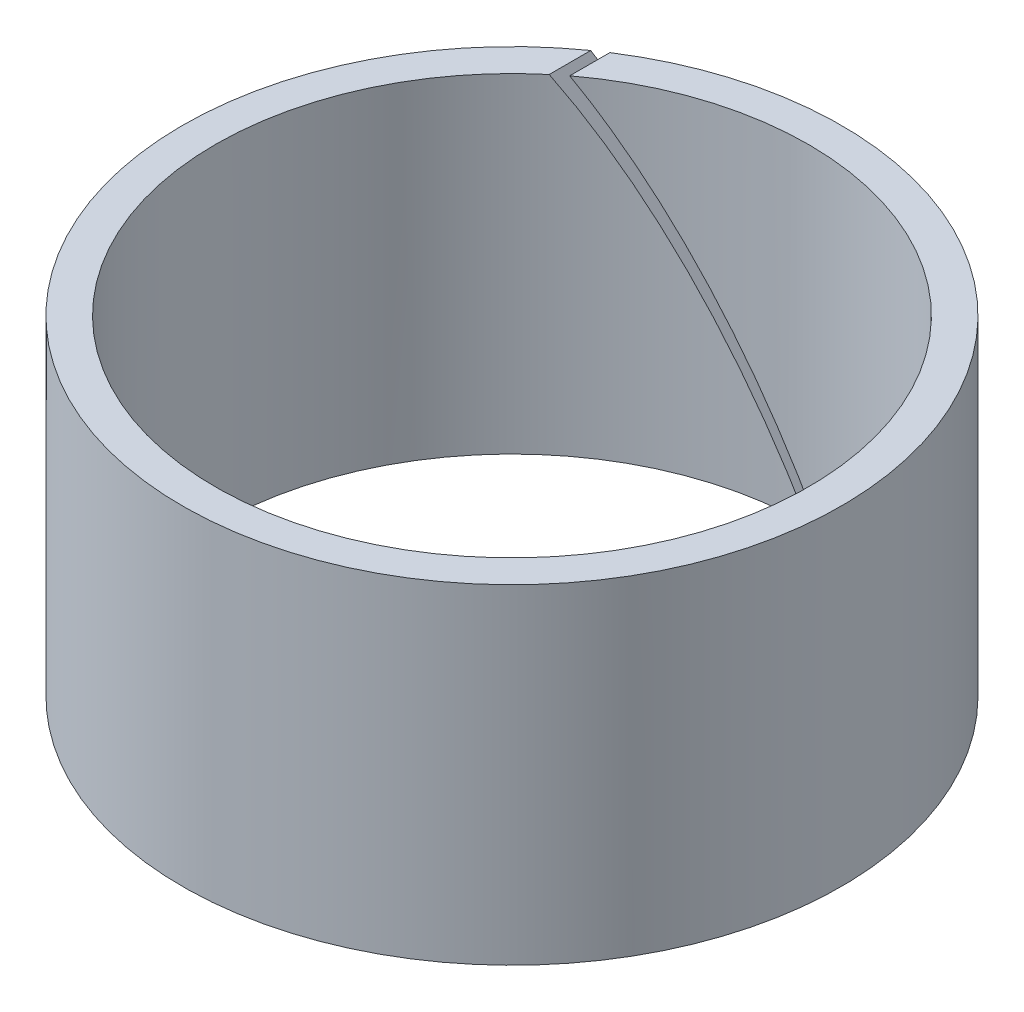
ISO-10303-21;
HEADER;
FILE_DESCRIPTION(('STEP AP214'),'2;1');
FILE_NAME('part.step','',(''),(''),'','','');
FILE_SCHEMA(('AUTOMOTIVE_DESIGN { 1 0 10303 214 1 1 1 1 }'));
ENDSEC;
DATA;
#1=APPLICATION_CONTEXT('core data for automotive mechanical design processes');
#2=APPLICATION_PROTOCOL_DEFINITION('international standard','automotive_design',2000,#1);
#3=PRODUCT_CONTEXT('',#1,'mechanical');
#4=PRODUCT('Part','Part','',(#3));
#5=PRODUCT_RELATED_PRODUCT_CATEGORY('part','',(#4));
#6=PRODUCT_DEFINITION_FORMATION('','',#4);
#7=PRODUCT_DEFINITION_CONTEXT('part definition',#1,'design');
#8=PRODUCT_DEFINITION('design','',#6,#7);
#9=PRODUCT_DEFINITION_SHAPE('','',#8);
#10=(LENGTH_UNIT() NAMED_UNIT(*) SI_UNIT(.MILLI.,.METRE.));
#11=(NAMED_UNIT(*) PLANE_ANGLE_UNIT() SI_UNIT($,.RADIAN.));
#12=(NAMED_UNIT(*) SI_UNIT($,.STERADIAN.) SOLID_ANGLE_UNIT());
#13=UNCERTAINTY_MEASURE_WITH_UNIT(LENGTH_MEASURE(1.E-05),#10,'distance_accuracy_value','');
#14=(GEOMETRIC_REPRESENTATION_CONTEXT(3) GLOBAL_UNCERTAINTY_ASSIGNED_CONTEXT((#13)) GLOBAL_UNIT_ASSIGNED_CONTEXT((#10,
#11,#12)) REPRESENTATION_CONTEXT('',''));
#15=CARTESIAN_POINT('',(0.,0.,0.));
#16=DIRECTION('',(0.,0.,1.));
#17=DIRECTION('',(1.,0.,0.));
#18=AXIS2_PLACEMENT_3D('',#15,#16,#17);
#19=CARTESIAN_POINT('',(0.,10.,0.));
#20=DIRECTION('',(0.,1.,0.));
#21=DIRECTION('',(0.,0.,1.));
#22=AXIS2_PLACEMENT_3D('',#19,#20,#21);
#23=PLANE('',#22);
#24=DIRECTION('',(0.,0.,1.));
#25=VECTOR('',#24,1.);
#26=CARTESIAN_POINT('',(-5.77350269189628,10.,-10.001));
#27=LINE('',#26,#25);
#28=CARTESIAN_POINT('',(-5.77350269189628,10.,-8.16496580927725));
#29=VERTEX_POINT('',#28);
#30=CARTESIAN_POINT('',(-5.77350269189628,10.,-6.90410505906932));
#31=VERTEX_POINT('',#30);
#32=EDGE_CURVE('E65',#29,#31,#27,.T.);
#33=ORIENTED_EDGE('',*,*,#32,.F.);
#34=CARTESIAN_POINT('',(0.,10.,0.));
#35=DIRECTION('',(0.,1.,0.));
#36=DIRECTION('',(0.,0.,1.));
#37=AXIS2_PLACEMENT_3D('',#34,#35,#36);
#38=CIRCLE('',#37,10.);
#39=CARTESIAN_POINT('',(-5.42709253038251,10.,-8.39920631170985));
#40=VERTEX_POINT('',#39);
#41=EDGE_CURVE('E11',#29,#40,#38,.T.);
#42=ORIENTED_EDGE('',*,*,#41,.T.);
#43=DIRECTION('',(0.,0.,1.));
#44=VECTOR('',#43,1.);
#45=CARTESIAN_POINT('',(-5.42709253038251,10.,-10.001));
#46=LINE('',#45,#44);
#47=CARTESIAN_POINT('',(-5.42709253038251,10.,-7.17960073170274));
#48=VERTEX_POINT('',#47);
#49=EDGE_CURVE('E79',#40,#48,#46,.T.);
#50=ORIENTED_EDGE('',*,*,#49,.T.);
#51=CARTESIAN_POINT('',(0.,10.,0.));
#52=DIRECTION('',(0.,1.,0.));
#53=DIRECTION('',(0.,0.,1.));
#54=AXIS2_PLACEMENT_3D('',#51,#52,#53);
#55=CIRCLE('',#54,9.);
#56=EDGE_CURVE('E93',#31,#48,#55,.T.);
#57=ORIENTED_EDGE('',*,*,#56,.F.);
#58=EDGE_LOOP('',(#33,#42,#50,#57));
#59=FACE_BOUND('',#58,.T.);
#60=ADVANCED_FACE('F39',(#59),#23,.T.);
#61=CARTESIAN_POINT('',(0.,0.,0.));
#62=DIRECTION('',(0.,1.,0.));
#63=DIRECTION('',(0.,0.,1.));
#64=AXIS2_PLACEMENT_3D('',#61,#62,#63);
#65=PLANE('',#64);
#66=CARTESIAN_POINT('',(0.,0.,0.));
#67=DIRECTION('',(0.,1.,0.));
#68=DIRECTION('',(0.,0.,1.));
#69=AXIS2_PLACEMENT_3D('',#66,#67,#68);
#70=CIRCLE('',#69,10.);
#71=CARTESIAN_POINT('',(0.,0.,-10.));
#72=VERTEX_POINT('',#71);
#73=CARTESIAN_POINT('',(0.346410161513777,0.,-9.9939981989192));
#74=VERTEX_POINT('',#73);
#75=EDGE_CURVE('E43',#72,#74,#70,.T.);
#76=ORIENTED_EDGE('',*,*,#75,.F.);
#77=DIRECTION('',(0.,0.,1.));
#78=VECTOR('',#77,1.);
#79=CARTESIAN_POINT('',(0.,0.,-10.001));
#80=LINE('',#79,#78);
#81=CARTESIAN_POINT('',(0.,0.,-9.00000000000001));
#82=VERTEX_POINT('',#81);
#83=EDGE_CURVE('E87',#72,#82,#80,.T.);
#84=ORIENTED_EDGE('',*,*,#83,.T.);
#85=CARTESIAN_POINT('',(0.,0.,0.));
#86=DIRECTION('',(0.,1.,0.));
#87=DIRECTION('',(0.,0.,1.));
#88=AXIS2_PLACEMENT_3D('',#85,#86,#87);
#89=CIRCLE('',#88,9.);
#90=CARTESIAN_POINT('',(0.346410161513777,0.,-8.99333086236685));
#91=VERTEX_POINT('',#90);
#92=EDGE_CURVE('E96',#82,#91,#89,.T.);
#93=ORIENTED_EDGE('',*,*,#92,.T.);
#94=DIRECTION('',(0.,0.,1.));
#95=VECTOR('',#94,1.);
#96=CARTESIAN_POINT('',(0.346410161513777,0.,-10.001));
#97=LINE('',#96,#95);
#98=EDGE_CURVE('E53',#74,#91,#97,.T.);
#99=ORIENTED_EDGE('',*,*,#98,.F.);
#100=EDGE_LOOP('',(#76,#84,#93,#99));
#101=FACE_BOUND('',#100,.T.);
#102=ADVANCED_FACE('F114',(#101),#65,.F.);
#103=CARTESIAN_POINT('',(0.,10.,0.));
#104=DIRECTION('',(0.,-1.,0.));
#105=DIRECTION('',(0.,0.,-1.));
#106=AXIS2_PLACEMENT_3D('',#103,#104,#105);
#107=CYLINDRICAL_SURFACE('',#106,10.);
#108=ORIENTED_EDGE('',*,*,#41,.F.);
#109=CARTESIAN_POINT('',(0.,0.,0.));
#110=DIRECTION('',(-0.866025403784439,-0.500000000000001,0.));
#111=DIRECTION('',(0.500000000000002,-0.866025403784438,0.));
#112=AXIS2_PLACEMENT_3D('',#109,#110,#111);
#113=ELLIPSE('',#112,19.9999999999999,10.);
#114=EDGE_CURVE('E105',#72,#29,#113,.F.);
#115=ORIENTED_EDGE('',*,*,#114,.F.);
#116=ORIENTED_EDGE('',*,*,#75,.T.);
#117=CARTESIAN_POINT('',(0.,0.599999999999989,0.));
#118=DIRECTION('',(0.866025403784439,0.500000000000001,0.));
#119=DIRECTION('',(0.500000000000002,-0.866025403784438,0.));
#120=AXIS2_PLACEMENT_3D('',#117,#118,#119);
#121=ELLIPSE('',#120,19.9999999999999,10.);
#122=EDGE_CURVE('E88',#40,#74,#121,.F.);
#123=ORIENTED_EDGE('',*,*,#122,.F.);
#124=EDGE_LOOP('',(#108,#115,#116,#123));
#125=FACE_BOUND('',#124,.T.);
#126=ADVANCED_FACE('F41',(#125),#107,.T.);
#127=CARTESIAN_POINT('',(0.,10.,0.));
#128=DIRECTION('',(0.,-1.,0.));
#129=DIRECTION('',(0.,0.,-1.));
#130=AXIS2_PLACEMENT_3D('',#127,#128,#129);
#131=CYLINDRICAL_SURFACE('',#130,9.);
#132=CARTESIAN_POINT('',(0.,0.,0.));
#133=DIRECTION('',(-0.866025403784439,-0.500000000000001,0.));
#134=DIRECTION('',(0.500000000000002,-0.866025403784438,0.));
#135=AXIS2_PLACEMENT_3D('',#132,#133,#134);
#136=ELLIPSE('',#135,18.,9.);
#137=EDGE_CURVE('E92',#82,#31,#136,.F.);
#138=ORIENTED_EDGE('',*,*,#137,.T.);
#139=ORIENTED_EDGE('',*,*,#56,.T.);
#140=CARTESIAN_POINT('',(0.,0.599999999999989,0.));
#141=DIRECTION('',(0.866025403784439,0.500000000000001,0.));
#142=DIRECTION('',(0.500000000000002,-0.866025403784438,0.));
#143=AXIS2_PLACEMENT_3D('',#140,#141,#142);
#144=ELLIPSE('',#143,18.,9.);
#145=EDGE_CURVE('E80',#48,#91,#144,.F.);
#146=ORIENTED_EDGE('',*,*,#145,.T.);
#147=ORIENTED_EDGE('',*,*,#92,.F.);
#148=EDGE_LOOP('',(#138,#139,#146,#147));
#149=FACE_BOUND('',#148,.T.);
#150=ADVANCED_FACE('F94',(#149),#131,.F.);
#151=CARTESIAN_POINT('',(0.346410161513777,0.,-10.001));
#152=DIRECTION('',(0.866025403784439,0.500000000000001,0.));
#153=DIRECTION('',(-0.500000000000002,0.866025403784438,0.));
#154=AXIS2_PLACEMENT_3D('',#151,#152,#153);
#155=PLANE('',#154);
#156=ORIENTED_EDGE('',*,*,#122,.T.);
#157=ORIENTED_EDGE('',*,*,#98,.T.);
#158=ORIENTED_EDGE('',*,*,#145,.F.);
#159=ORIENTED_EDGE('',*,*,#49,.F.);
#160=EDGE_LOOP('',(#156,#157,#158,#159));
#161=FACE_BOUND('',#160,.T.);
#162=ADVANCED_FACE('F78',(#161),#155,.F.);
#163=CARTESIAN_POINT('',(0.,0.,-10.001));
#164=DIRECTION('',(-0.866025403784439,-0.500000000000001,0.));
#165=DIRECTION('',(0.500000000000002,-0.866025403784438,0.));
#166=AXIS2_PLACEMENT_3D('',#163,#164,#165);
#167=PLANE('',#166);
#168=ORIENTED_EDGE('',*,*,#114,.T.);
#169=ORIENTED_EDGE('',*,*,#32,.T.);
#170=ORIENTED_EDGE('',*,*,#137,.F.);
#171=ORIENTED_EDGE('',*,*,#83,.F.);
#172=EDGE_LOOP('',(#168,#169,#170,#171));
#173=FACE_BOUND('',#172,.T.);
#174=ADVANCED_FACE('F108',(#173),#167,.F.);
#175=CLOSED_SHELL('',(#60,#102,#126,#150,#162,#174));
#176=MANIFOLD_SOLID_BREP('B2',#175);
#177=ADVANCED_BREP_SHAPE_REPRESENTATION('',(#18,#176),#14);
#178=SHAPE_DEFINITION_REPRESENTATION(#9,#177);
ENDSEC;
END-ISO-10303-21;
